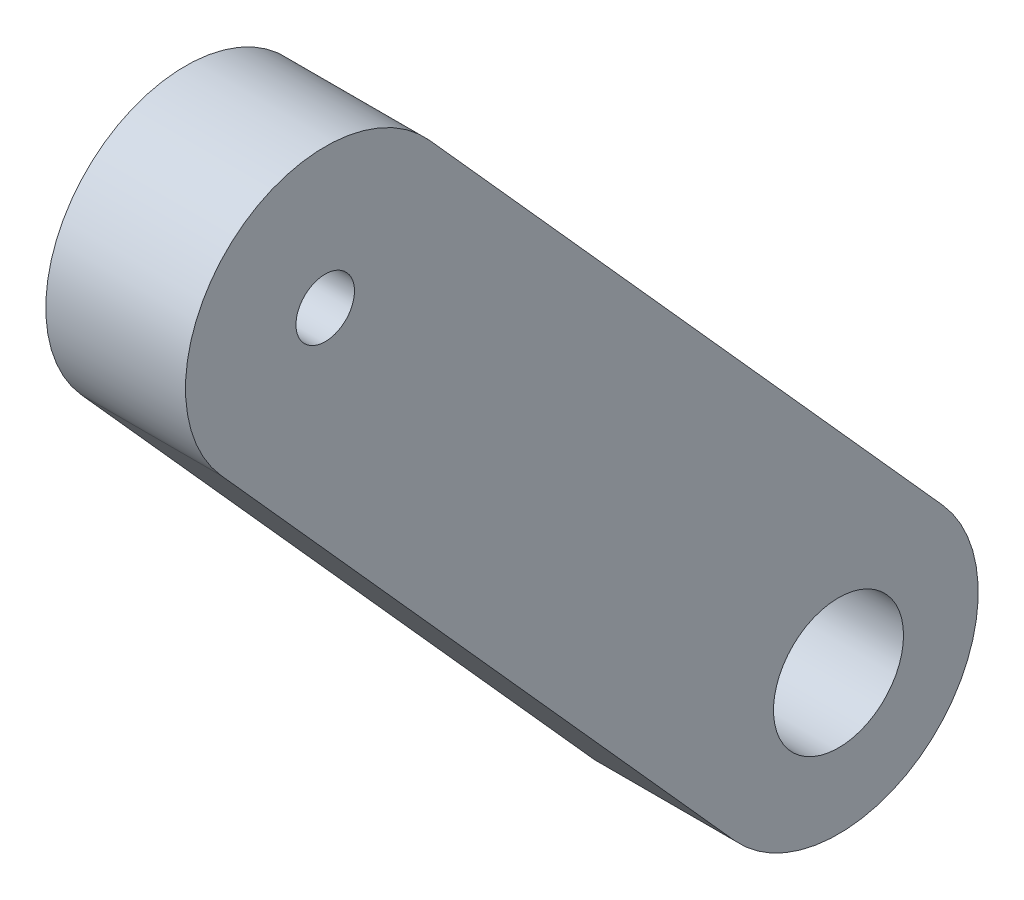
ISO-10303-21;
HEADER;
FILE_DESCRIPTION(('STEP AP214'),'2;1');
FILE_NAME('part.step','',(''),(''),'','','');
FILE_SCHEMA(('AUTOMOTIVE_DESIGN { 1 0 10303 214 1 1 1 1 }'));
ENDSEC;
DATA;
#1=APPLICATION_CONTEXT('core data for automotive mechanical design processes');
#2=APPLICATION_PROTOCOL_DEFINITION('international standard','automotive_design',2000,#1);
#3=PRODUCT_CONTEXT('',#1,'mechanical');
#4=PRODUCT('Part','Part','',(#3));
#5=PRODUCT_RELATED_PRODUCT_CATEGORY('part','',(#4));
#6=PRODUCT_DEFINITION_FORMATION('','',#4);
#7=PRODUCT_DEFINITION_CONTEXT('part definition',#1,'design');
#8=PRODUCT_DEFINITION('design','',#6,#7);
#9=PRODUCT_DEFINITION_SHAPE('','',#8);
#10=(LENGTH_UNIT() NAMED_UNIT(*) SI_UNIT(.MILLI.,.METRE.));
#11=(NAMED_UNIT(*) PLANE_ANGLE_UNIT() SI_UNIT($,.RADIAN.));
#12=(NAMED_UNIT(*) SI_UNIT($,.STERADIAN.) SOLID_ANGLE_UNIT());
#13=UNCERTAINTY_MEASURE_WITH_UNIT(LENGTH_MEASURE(1.E-05),#10,'distance_accuracy_value','');
#14=(GEOMETRIC_REPRESENTATION_CONTEXT(3) GLOBAL_UNCERTAINTY_ASSIGNED_CONTEXT((#13)) GLOBAL_UNIT_ASSIGNED_CONTEXT((#10,
#11,#12)) REPRESENTATION_CONTEXT('',''));
#15=CARTESIAN_POINT('',(0.,0.,0.));
#16=DIRECTION('',(0.,0.,1.));
#17=DIRECTION('',(1.,0.,0.));
#18=AXIS2_PLACEMENT_3D('',#15,#16,#17);
#19=CARTESIAN_POINT('',(-18.2875897168308,13.224464490122,21.1768212041954));
#20=DIRECTION('',(1.,0.,0.));
#21=DIRECTION('',(0.,0.,-1.));
#22=AXIS2_PLACEMENT_3D('',#19,#20,#21);
#23=PLANE('',#22);
#24=CARTESIAN_POINT('',(-18.2875897168308,-6.34999999998841,3.63320740492896));
#25=DIRECTION('',(1.,0.,0.));
#26=DIRECTION('',(0.,0.,-1.));
#27=AXIS2_PLACEMENT_3D('',#24,#25,#26);
#28=CIRCLE('',#27,2.22249999999513);
#29=CARTESIAN_POINT('',(-18.2875897168308,-6.34999999998841,1.41070740493382));
#30=VERTEX_POINT('',#29);
#31=EDGE_CURVE('E102',#30,#30,#28,.T.);
#32=ORIENTED_EDGE('',*,*,#31,.F.);
#33=EDGE_LOOP('',(#32));
#34=FACE_BOUND('',#33,.T.);
#35=CARTESIAN_POINT('',(-18.2875897168308,13.224464490122,21.1768212041954));
#36=DIRECTION('',(1.,0.,0.));
#37=DIRECTION('',(0.,0.,-1.));
#38=AXIS2_PLACEMENT_3D('',#35,#36,#37);
#39=CIRCLE('',#38,4.77520000000001);
#40=CARTESIAN_POINT('',(-18.2875897168308,16.4115305891032,17.620819977997));
#41=VERTEX_POINT('',#40);
#42=CARTESIAN_POINT('',(-18.2875897168308,10.0373983911407,24.7328224303938));
#43=VERTEX_POINT('',#42);
#44=EDGE_CURVE('E87',#41,#43,#39,.T.);
#45=ORIENTED_EDGE('',*,*,#44,.T.);
#46=DIRECTION('',(0.,-0.744681107848551,-0.667420442909456));
#47=VECTOR('',#46,1.);
#48=CARTESIAN_POINT('',(-18.2875897168308,10.0373983911407,24.7328224303938));
#49=LINE('',#48,#47);
#50=CARTESIAN_POINT('',(-18.2875897168308,-9.53706609896965,7.18920863112737));
#51=VERTEX_POINT('',#50);
#52=EDGE_CURVE('E82',#43,#51,#49,.T.);
#53=ORIENTED_EDGE('',*,*,#52,.T.);
#54=CARTESIAN_POINT('',(-18.2875897168308,-6.34999999998841,3.63320740492896));
#55=DIRECTION('',(1.,0.,0.));
#56=DIRECTION('',(0.,0.,-1.));
#57=AXIS2_PLACEMENT_3D('',#54,#55,#56);
#58=CIRCLE('',#57,4.77520000000001);
#59=CARTESIAN_POINT('',(-18.2875897168308,-3.16293390100717,0.0772061787305523));
#60=VERTEX_POINT('',#59);
#61=EDGE_CURVE('E85',#51,#60,#58,.T.);
#62=ORIENTED_EDGE('',*,*,#61,.T.);
#63=DIRECTION('',(0.,0.744681107848551,0.667420442909456));
#64=VECTOR('',#63,1.);
#65=CARTESIAN_POINT('',(-18.2875897168308,16.4115305891032,17.620819977997));
#66=LINE('',#65,#64);
#67=EDGE_CURVE('E52',#60,#41,#66,.T.);
#68=ORIENTED_EDGE('',*,*,#67,.T.);
#69=EDGE_LOOP('',(#45,#53,#62,#68));
#70=FACE_BOUND('',#69,.T.);
#71=CARTESIAN_POINT('',(-18.2875897168308,13.224464490122,21.1768212041954));
#72=DIRECTION('',(1.,0.,0.));
#73=DIRECTION('',(0.,0.,-1.));
#74=AXIS2_PLACEMENT_3D('',#71,#72,#73);
#75=CIRCLE('',#74,0.999999999980751);
#76=CARTESIAN_POINT('',(-18.2875897168308,13.224464490122,20.1768212042147));
#77=VERTEX_POINT('',#76);
#78=EDGE_CURVE('E117',#77,#77,#75,.T.);
#79=ORIENTED_EDGE('',*,*,#78,.F.);
#80=EDGE_LOOP('',(#79));
#81=FACE_BOUND('',#80,.T.);
#82=ADVANCED_FACE('F35',(#34,#70,#81),#23,.T.);
#83=CARTESIAN_POINT('',(-23.0627897168308,13.224464490122,21.1768212041954));
#84=DIRECTION('',(1.,0.,0.));
#85=DIRECTION('',(0.,0.,-1.));
#86=AXIS2_PLACEMENT_3D('',#83,#84,#85);
#87=PLANE('',#86);
#88=CARTESIAN_POINT('',(-23.0627897168308,13.224464490122,21.1768212041954));
#89=DIRECTION('',(1.,0.,0.));
#90=DIRECTION('',(0.,0.,-1.));
#91=AXIS2_PLACEMENT_3D('',#88,#89,#90);
#92=CIRCLE('',#91,4.77520000000001);
#93=CARTESIAN_POINT('',(-23.0627897168308,16.4115305891032,17.620819977997));
#94=VERTEX_POINT('',#93);
#95=CARTESIAN_POINT('',(-23.0627897168308,10.0373983911407,24.7328224303938));
#96=VERTEX_POINT('',#95);
#97=EDGE_CURVE('E99',#94,#96,#92,.T.);
#98=ORIENTED_EDGE('',*,*,#97,.F.);
#99=DIRECTION('',(0.,0.744681107848551,0.667420442909456));
#100=VECTOR('',#99,1.);
#101=CARTESIAN_POINT('',(-23.0627897168308,16.4115305891032,17.620819977997));
#102=LINE('',#101,#100);
#103=CARTESIAN_POINT('',(-23.0627897168308,-3.16293390100717,0.0772061787305523));
#104=VERTEX_POINT('',#103);
#105=EDGE_CURVE('E75',#104,#94,#102,.T.);
#106=ORIENTED_EDGE('',*,*,#105,.F.);
#107=CARTESIAN_POINT('',(-23.0627897168308,-6.34999999998841,3.63320740492896));
#108=DIRECTION('',(1.,0.,0.));
#109=DIRECTION('',(0.,0.,-1.));
#110=AXIS2_PLACEMENT_3D('',#107,#108,#109);
#111=CIRCLE('',#110,4.77520000000001);
#112=CARTESIAN_POINT('',(-23.0627897168308,-9.53706609896965,7.18920863112737));
#113=VERTEX_POINT('',#112);
#114=EDGE_CURVE('E69',#113,#104,#111,.T.);
#115=ORIENTED_EDGE('',*,*,#114,.F.);
#116=DIRECTION('',(0.,-0.744681107848551,-0.667420442909456));
#117=VECTOR('',#116,1.);
#118=CARTESIAN_POINT('',(-23.0627897168308,10.0373983911407,24.7328224303938));
#119=LINE('',#118,#117);
#120=EDGE_CURVE('E91',#96,#113,#119,.T.);
#121=ORIENTED_EDGE('',*,*,#120,.F.);
#122=EDGE_LOOP('',(#98,#106,#115,#121));
#123=FACE_BOUND('',#122,.T.);
#124=CARTESIAN_POINT('',(-23.0627897168308,-6.34999999998841,3.63320740492896));
#125=DIRECTION('',(1.,0.,0.));
#126=DIRECTION('',(0.,0.,-1.));
#127=AXIS2_PLACEMENT_3D('',#124,#125,#126);
#128=CIRCLE('',#127,2.22249999999513);
#129=CARTESIAN_POINT('',(-23.0627897168308,-6.34999999998841,1.41070740493382));
#130=VERTEX_POINT('',#129);
#131=EDGE_CURVE('E114',#130,#130,#128,.T.);
#132=ORIENTED_EDGE('',*,*,#131,.T.);
#133=EDGE_LOOP('',(#132));
#134=FACE_BOUND('',#133,.T.);
#135=CARTESIAN_POINT('',(-23.0627897168308,13.224464490122,21.1768212041954));
#136=DIRECTION('',(1.,0.,0.));
#137=DIRECTION('',(0.,0.,-1.));
#138=AXIS2_PLACEMENT_3D('',#135,#136,#137);
#139=CIRCLE('',#138,0.999999999980751);
#140=CARTESIAN_POINT('',(-23.0627897168308,13.224464490122,20.1768212042147));
#141=VERTEX_POINT('',#140);
#142=EDGE_CURVE('E120',#141,#141,#139,.T.);
#143=ORIENTED_EDGE('',*,*,#142,.T.);
#144=EDGE_LOOP('',(#143));
#145=FACE_BOUND('',#144,.T.);
#146=ADVANCED_FACE('F110',(#123,#134,#145),#87,.F.);
#147=CARTESIAN_POINT('',(-18.2875897168308,13.224464490122,21.1768212041954));
#148=DIRECTION('',(-1.,0.,0.));
#149=DIRECTION('',(0.,0.,1.));
#150=AXIS2_PLACEMENT_3D('',#147,#148,#149);
#151=CYLINDRICAL_SURFACE('',#150,4.77520000000001);
#152=ORIENTED_EDGE('',*,*,#97,.T.);
#153=DIRECTION('',(-1.,0.,0.));
#154=VECTOR('',#153,1.);
#155=CARTESIAN_POINT('',(-18.2875897168308,10.0373983911407,24.7328224303938));
#156=LINE('',#155,#154);
#157=EDGE_CURVE('E11',#43,#96,#156,.T.);
#158=ORIENTED_EDGE('',*,*,#157,.F.);
#159=ORIENTED_EDGE('',*,*,#44,.F.);
#160=DIRECTION('',(-1.,0.,0.));
#161=VECTOR('',#160,1.);
#162=CARTESIAN_POINT('',(-18.2875897168308,16.4115305891032,17.620819977997));
#163=LINE('',#162,#161);
#164=EDGE_CURVE('E95',#41,#94,#163,.T.);
#165=ORIENTED_EDGE('',*,*,#164,.T.);
#166=EDGE_LOOP('',(#152,#158,#159,#165));
#167=FACE_BOUND('',#166,.T.);
#168=ADVANCED_FACE('F37',(#167),#151,.T.);
#169=CARTESIAN_POINT('',(-18.2875897168308,10.0373983911407,24.7328224303938));
#170=DIRECTION('',(0.,0.667420442909456,-0.744681107848551));
#171=DIRECTION('',(0.,0.744681107848551,0.667420442909456));
#172=AXIS2_PLACEMENT_3D('',#169,#170,#171);
#173=PLANE('',#172);
#174=ORIENTED_EDGE('',*,*,#120,.T.);
#175=DIRECTION('',(-1.,0.,0.));
#176=VECTOR('',#175,1.);
#177=CARTESIAN_POINT('',(-18.2875897168308,-9.53706609896965,7.18920863112737));
#178=LINE('',#177,#176);
#179=EDGE_CURVE('E44',#51,#113,#178,.T.);
#180=ORIENTED_EDGE('',*,*,#179,.F.);
#181=ORIENTED_EDGE('',*,*,#52,.F.);
#182=ORIENTED_EDGE('',*,*,#157,.T.);
#183=EDGE_LOOP('',(#174,#180,#181,#182));
#184=FACE_BOUND('',#183,.T.);
#185=ADVANCED_FACE('F90',(#184),#173,.F.);
#186=CARTESIAN_POINT('',(-18.2875897168308,-6.34999999998841,3.63320740492896));
#187=DIRECTION('',(-1.,0.,0.));
#188=DIRECTION('',(0.,0.,1.));
#189=AXIS2_PLACEMENT_3D('',#186,#187,#188);
#190=CYLINDRICAL_SURFACE('',#189,4.77520000000001);
#191=ORIENTED_EDGE('',*,*,#114,.T.);
#192=DIRECTION('',(-1.,0.,0.));
#193=VECTOR('',#192,1.);
#194=CARTESIAN_POINT('',(-18.2875897168308,-3.16293390100717,0.0772061787305523));
#195=LINE('',#194,#193);
#196=EDGE_CURVE('E92',#60,#104,#195,.T.);
#197=ORIENTED_EDGE('',*,*,#196,.F.);
#198=ORIENTED_EDGE('',*,*,#61,.F.);
#199=ORIENTED_EDGE('',*,*,#179,.T.);
#200=EDGE_LOOP('',(#191,#197,#198,#199));
#201=FACE_BOUND('',#200,.T.);
#202=ADVANCED_FACE('F93',(#201),#190,.T.);
#203=CARTESIAN_POINT('',(-18.2875897168308,16.4115305891032,17.620819977997));
#204=DIRECTION('',(0.,-0.667420442909456,0.744681107848551));
#205=DIRECTION('',(0.,-0.744681107848551,-0.667420442909456));
#206=AXIS2_PLACEMENT_3D('',#203,#204,#205);
#207=PLANE('',#206);
#208=ORIENTED_EDGE('',*,*,#105,.T.);
#209=ORIENTED_EDGE('',*,*,#164,.F.);
#210=ORIENTED_EDGE('',*,*,#67,.F.);
#211=ORIENTED_EDGE('',*,*,#196,.T.);
#212=EDGE_LOOP('',(#208,#209,#210,#211));
#213=FACE_BOUND('',#212,.T.);
#214=ADVANCED_FACE('F107',(#213),#207,.F.);
#215=CARTESIAN_POINT('',(-18.2875897168308,-6.34999999998841,3.63320740492896));
#216=DIRECTION('',(-1.,0.,0.));
#217=DIRECTION('',(0.,0.,1.));
#218=AXIS2_PLACEMENT_3D('',#215,#216,#217);
#219=CYLINDRICAL_SURFACE('',#218,2.22249999999513);
#220=ORIENTED_EDGE('',*,*,#31,.T.);
#221=EDGE_LOOP('',(#220));
#222=FACE_BOUND('',#221,.T.);
#223=ORIENTED_EDGE('',*,*,#131,.F.);
#224=EDGE_LOOP('',(#223));
#225=FACE_BOUND('',#224,.T.);
#226=ADVANCED_FACE('F137',(#222,#225),#219,.F.);
#227=CARTESIAN_POINT('',(-18.2875897168308,13.224464490122,21.1768212041954));
#228=DIRECTION('',(-1.,0.,0.));
#229=DIRECTION('',(0.,0.,1.));
#230=AXIS2_PLACEMENT_3D('',#227,#228,#229);
#231=CYLINDRICAL_SURFACE('',#230,0.999999999980751);
#232=ORIENTED_EDGE('',*,*,#78,.T.);
#233=EDGE_LOOP('',(#232));
#234=FACE_BOUND('',#233,.T.);
#235=ORIENTED_EDGE('',*,*,#142,.F.);
#236=EDGE_LOOP('',(#235));
#237=FACE_BOUND('',#236,.T.);
#238=ADVANCED_FACE('F126',(#234,#237),#231,.F.);
#239=CLOSED_SHELL('',(#82,#146,#168,#185,#202,#214,#226,#238));
#240=MANIFOLD_SOLID_BREP('B2',#239);
#241=ADVANCED_BREP_SHAPE_REPRESENTATION('',(#18,#240),#14);
#242=SHAPE_DEFINITION_REPRESENTATION(#9,#241);
ENDSEC;
END-ISO-10303-21;
